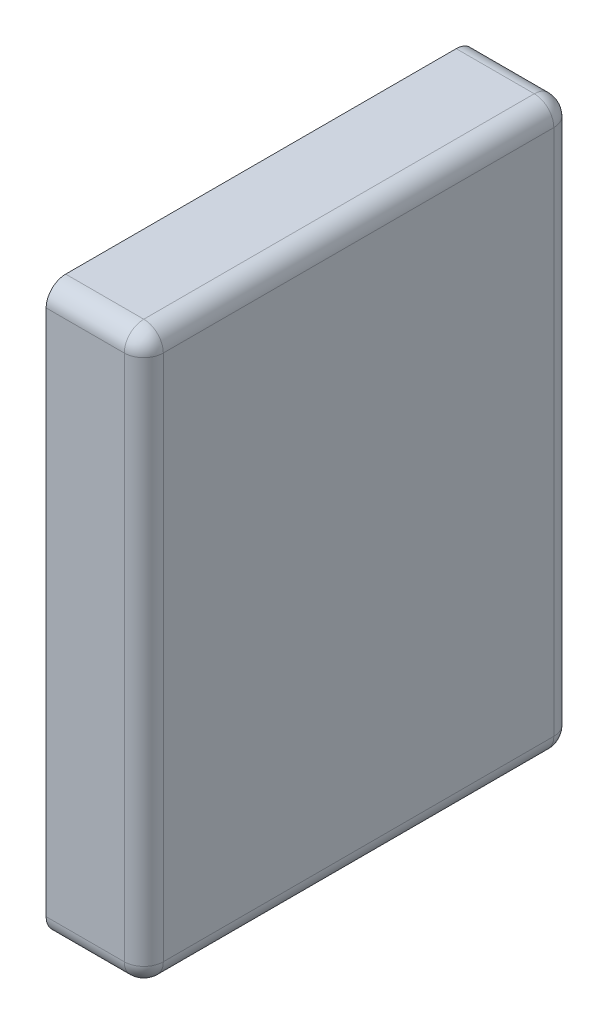
ISO-10303-21;
HEADER;
FILE_DESCRIPTION(('STEP AP214'),'2;1');
FILE_NAME('part.step','',(''),(''),'','','');
FILE_SCHEMA(('AUTOMOTIVE_DESIGN { 1 0 10303 214 1 1 1 1 }'));
ENDSEC;
DATA;
#1=APPLICATION_CONTEXT('core data for automotive mechanical design processes');
#2=APPLICATION_PROTOCOL_DEFINITION('international standard','automotive_design',2000,#1);
#3=PRODUCT_CONTEXT('',#1,'mechanical');
#4=PRODUCT('Part','Part','',(#3));
#5=PRODUCT_RELATED_PRODUCT_CATEGORY('part','',(#4));
#6=PRODUCT_DEFINITION_FORMATION('','',#4);
#7=PRODUCT_DEFINITION_CONTEXT('part definition',#1,'design');
#8=PRODUCT_DEFINITION('design','',#6,#7);
#9=PRODUCT_DEFINITION_SHAPE('','',#8);
#10=(LENGTH_UNIT() NAMED_UNIT(*) SI_UNIT(.MILLI.,.METRE.));
#11=(NAMED_UNIT(*) PLANE_ANGLE_UNIT() SI_UNIT($,.RADIAN.));
#12=(NAMED_UNIT(*) SI_UNIT($,.STERADIAN.) SOLID_ANGLE_UNIT());
#13=UNCERTAINTY_MEASURE_WITH_UNIT(LENGTH_MEASURE(1.E-05),#10,'distance_accuracy_value','');
#14=(GEOMETRIC_REPRESENTATION_CONTEXT(3) GLOBAL_UNCERTAINTY_ASSIGNED_CONTEXT((#13)) GLOBAL_UNIT_ASSIGNED_CONTEXT((#10,
#11,#12)) REPRESENTATION_CONTEXT('',''));
#15=CARTESIAN_POINT('',(0.,0.,0.));
#16=DIRECTION('',(0.,0.,1.));
#17=DIRECTION('',(1.,0.,0.));
#18=AXIS2_PLACEMENT_3D('',#15,#16,#17);
#19=CARTESIAN_POINT('',(2.2,0.,0.));
#20=DIRECTION('',(1.,0.,0.));
#21=DIRECTION('',(0.,0.,-1.));
#22=AXIS2_PLACEMENT_3D('',#19,#20,#21);
#23=PLANE('',#22);
#24=DIRECTION('',(0.,0.,1.));
#25=VECTOR('',#24,1.);
#26=CARTESIAN_POINT('',(2.2,1.4,0.));
#27=LINE('',#26,#25);
#28=CARTESIAN_POINT('',(2.2,1.4,1.05));
#29=VERTEX_POINT('',#28);
#30=CARTESIAN_POINT('',(2.2,1.4,0.05));
#31=VERTEX_POINT('',#30);
#32=EDGE_CURVE('E175',#29,#31,#27,.F.);
#33=ORIENTED_EDGE('',*,*,#32,.F.);
#34=DIRECTION('',(0.,1.,0.));
#35=VECTOR('',#34,1.);
#36=CARTESIAN_POINT('',(2.2,0.,1.05));
#37=LINE('',#36,#35);
#38=CARTESIAN_POINT('',(2.2,0.05,1.05));
#39=VERTEX_POINT('',#38);
#40=EDGE_CURVE('E165',#39,#29,#37,.T.);
#41=ORIENTED_EDGE('',*,*,#40,.F.);
#42=DIRECTION('',(0.,0.,1.));
#43=VECTOR('',#42,1.);
#44=CARTESIAN_POINT('',(2.2,0.05,0.));
#45=LINE('',#44,#43);
#46=CARTESIAN_POINT('',(2.2,0.05,0.05));
#47=VERTEX_POINT('',#46);
#48=EDGE_CURVE('E211',#47,#39,#45,.T.);
#49=ORIENTED_EDGE('',*,*,#48,.F.);
#50=DIRECTION('',(0.,1.,0.));
#51=VECTOR('',#50,1.);
#52=CARTESIAN_POINT('',(2.2,0.,0.05));
#53=LINE('',#52,#51);
#54=EDGE_CURVE('E227',#31,#47,#53,.F.);
#55=ORIENTED_EDGE('',*,*,#54,.F.);
#56=EDGE_LOOP('',(#33,#41,#49,#55));
#57=FACE_BOUND('',#56,.T.);
#58=ADVANCED_FACE('F17',(#57),#23,.T.);
#59=CARTESIAN_POINT('',(2.15,0.05,0.));
#60=DIRECTION('',(0.,0.,1.));
#61=DIRECTION('',(1.,0.,0.));
#62=AXIS2_PLACEMENT_3D('',#59,#60,#61);
#63=CYLINDRICAL_SURFACE('',#62,0.05);
#64=CARTESIAN_POINT('',(2.15,0.05,0.05));
#65=DIRECTION('',(0.,-9.5846697953635E-13,-1.));
#66=DIRECTION('',(1.,0.,0.));
#67=AXIS2_PLACEMENT_3D('',#64,#65,#66);
#68=CIRCLE('',#67,0.05);
#69=CARTESIAN_POINT('',(2.15,0.,0.050000000000012));
#70=VERTEX_POINT('',#69);
#71=EDGE_CURVE('E207',#47,#70,#68,.T.);
#72=ORIENTED_EDGE('',*,*,#71,.F.);
#73=ORIENTED_EDGE('',*,*,#48,.T.);
#74=CARTESIAN_POINT('',(2.15,0.05,1.05));
#75=DIRECTION('',(0.,0.,-1.));
#76=DIRECTION('',(1.,0.,0.));
#77=AXIS2_PLACEMENT_3D('',#74,#75,#76);
#78=CIRCLE('',#77,0.05);
#79=CARTESIAN_POINT('',(2.15,0.,1.05));
#80=VERTEX_POINT('',#79);
#81=EDGE_CURVE('E284',#80,#39,#78,.F.);
#82=ORIENTED_EDGE('',*,*,#81,.F.);
#83=DIRECTION('',(0.,0.,1.));
#84=VECTOR('',#83,1.);
#85=CARTESIAN_POINT('',(2.15,0.,0.));
#86=LINE('',#85,#84);
#87=EDGE_CURVE('E289',#80,#70,#86,.F.);
#88=ORIENTED_EDGE('',*,*,#87,.T.);
#89=EDGE_LOOP('',(#72,#73,#82,#88));
#90=FACE_BOUND('',#89,.T.);
#91=ADVANCED_FACE('F200',(#90),#63,.T.);
#92=CARTESIAN_POINT('',(2.15,0.05,0.05));
#93=DIRECTION('',(1.,0.,0.));
#94=DIRECTION('',(0.,1.,0.));
#95=AXIS2_PLACEMENT_3D('',#92,#93,#94);
#96=SPHERICAL_SURFACE('',#95,0.05);
#97=CARTESIAN_POINT('',(2.15,0.05,0.05));
#98=DIRECTION('',(1.,0.,0.));
#99=DIRECTION('',(0.,0.,-1.));
#100=AXIS2_PLACEMENT_3D('',#97,#98,#99);
#101=CIRCLE('',#100,0.05);
#102=CARTESIAN_POINT('',(2.15,0.05,0.));
#103=VERTEX_POINT('',#102);
#104=EDGE_CURVE('E124',#103,#70,#101,.F.);
#105=ORIENTED_EDGE('',*,*,#104,.F.);
#106=CARTESIAN_POINT('',(2.15,0.05,0.05));
#107=DIRECTION('',(0.,1.,0.));
#108=DIRECTION('',(0.,0.,1.));
#109=AXIS2_PLACEMENT_3D('',#106,#107,#108);
#110=CIRCLE('',#109,0.05);
#111=EDGE_CURVE('E210',#47,#103,#110,.T.);
#112=ORIENTED_EDGE('',*,*,#111,.F.);
#113=ORIENTED_EDGE('',*,*,#71,.T.);
#114=EDGE_LOOP('',(#105,#112,#113));
#115=FACE_BOUND('',#114,.T.);
#116=ADVANCED_FACE('F196',(#115),#96,.T.);
#117=CARTESIAN_POINT('',(2.15,0.,0.05));
#118=DIRECTION('',(0.,1.,0.));
#119=DIRECTION('',(0.,0.,1.));
#120=AXIS2_PLACEMENT_3D('',#117,#118,#119);
#121=CYLINDRICAL_SURFACE('',#120,0.05);
#122=CARTESIAN_POINT('',(2.15,1.4,0.0499999999999999));
#123=DIRECTION('',(0.,1.,0.));
#124=DIRECTION('',(1.,0.,0.));
#125=AXIS2_PLACEMENT_3D('',#122,#123,#124);
#126=CIRCLE('',#125,0.05);
#127=CARTESIAN_POINT('',(2.15,1.4,0.));
#128=VERTEX_POINT('',#127);
#129=EDGE_CURVE('E187',#31,#128,#126,.T.);
#130=ORIENTED_EDGE('',*,*,#129,.F.);
#131=ORIENTED_EDGE('',*,*,#54,.T.);
#132=ORIENTED_EDGE('',*,*,#111,.T.);
#133=DIRECTION('',(0.,1.,0.));
#134=VECTOR('',#133,1.);
#135=CARTESIAN_POINT('',(2.15,0.,0.));
#136=LINE('',#135,#134);
#137=EDGE_CURVE('E74',#103,#128,#136,.T.);
#138=ORIENTED_EDGE('',*,*,#137,.T.);
#139=EDGE_LOOP('',(#130,#131,#132,#138));
#140=FACE_BOUND('',#139,.T.);
#141=ADVANCED_FACE('F192',(#140),#121,.T.);
#142=CARTESIAN_POINT('',(2.15,1.4,0.05));
#143=DIRECTION('',(1.,0.,0.));
#144=DIRECTION('',(0.,1.,0.));
#145=AXIS2_PLACEMENT_3D('',#142,#143,#144);
#146=SPHERICAL_SURFACE('',#145,0.05);
#147=CARTESIAN_POINT('',(2.15,1.4,0.05));
#148=DIRECTION('',(1.,0.,0.));
#149=DIRECTION('',(0.,0.,-1.));
#150=AXIS2_PLACEMENT_3D('',#147,#148,#149);
#151=CIRCLE('',#150,0.05);
#152=CARTESIAN_POINT('',(2.15,1.45,0.05));
#153=VERTEX_POINT('',#152);
#154=EDGE_CURVE('E118',#153,#128,#151,.F.);
#155=ORIENTED_EDGE('',*,*,#154,.F.);
#156=CARTESIAN_POINT('',(2.15,1.4,0.05));
#157=DIRECTION('',(0.,0.,1.));
#158=DIRECTION('',(1.,0.,0.));
#159=AXIS2_PLACEMENT_3D('',#156,#157,#158);
#160=CIRCLE('',#159,0.05);
#161=EDGE_CURVE('E166',#31,#153,#160,.T.);
#162=ORIENTED_EDGE('',*,*,#161,.F.);
#163=ORIENTED_EDGE('',*,*,#129,.T.);
#164=EDGE_LOOP('',(#155,#162,#163));
#165=FACE_BOUND('',#164,.T.);
#166=ADVANCED_FACE('F189',(#165),#146,.T.);
#167=CARTESIAN_POINT('',(2.15,1.4,0.));
#168=DIRECTION('',(0.,0.,1.));
#169=DIRECTION('',(1.,0.,0.));
#170=AXIS2_PLACEMENT_3D('',#167,#168,#169);
#171=CYLINDRICAL_SURFACE('',#170,0.05);
#172=DIRECTION('',(0.,0.,1.));
#173=VECTOR('',#172,1.);
#174=CARTESIAN_POINT('',(2.15,1.45,0.));
#175=LINE('',#174,#173);
#176=CARTESIAN_POINT('',(2.15,1.45,1.05));
#177=VERTEX_POINT('',#176);
#178=EDGE_CURVE('E109',#177,#153,#175,.F.);
#179=ORIENTED_EDGE('',*,*,#178,.F.);
#180=CARTESIAN_POINT('',(2.15,1.4,1.05));
#181=DIRECTION('',(0.,0.,1.));
#182=DIRECTION('',(1.,0.,0.));
#183=AXIS2_PLACEMENT_3D('',#180,#181,#182);
#184=CIRCLE('',#183,0.05);
#185=EDGE_CURVE('E162',#29,#177,#184,.T.);
#186=ORIENTED_EDGE('',*,*,#185,.F.);
#187=ORIENTED_EDGE('',*,*,#32,.T.);
#188=ORIENTED_EDGE('',*,*,#161,.T.);
#189=EDGE_LOOP('',(#179,#186,#187,#188));
#190=FACE_BOUND('',#189,.T.);
#191=ADVANCED_FACE('F154',(#190),#171,.T.);
#192=CARTESIAN_POINT('',(2.15,1.4,1.05));
#193=DIRECTION('',(1.,0.,0.));
#194=DIRECTION('',(0.,0.,1.));
#195=AXIS2_PLACEMENT_3D('',#192,#193,#194);
#196=SPHERICAL_SURFACE('',#195,0.05);
#197=CARTESIAN_POINT('',(2.15,1.4,1.05));
#198=DIRECTION('',(1.,0.,0.));
#199=DIRECTION('',(0.,0.,-1.));
#200=AXIS2_PLACEMENT_3D('',#197,#198,#199);
#201=CIRCLE('',#200,0.05);
#202=CARTESIAN_POINT('',(2.15,1.4,1.1));
#203=VERTEX_POINT('',#202);
#204=EDGE_CURVE('E108',#203,#177,#201,.F.);
#205=ORIENTED_EDGE('',*,*,#204,.F.);
#206=CARTESIAN_POINT('',(2.15,1.4,1.05));
#207=DIRECTION('',(0.,1.,0.));
#208=DIRECTION('',(0.,0.,1.));
#209=AXIS2_PLACEMENT_3D('',#206,#207,#208);
#210=CIRCLE('',#209,0.05);
#211=EDGE_CURVE('E220',#29,#203,#210,.F.);
#212=ORIENTED_EDGE('',*,*,#211,.F.);
#213=ORIENTED_EDGE('',*,*,#185,.T.);
#214=EDGE_LOOP('',(#205,#212,#213));
#215=FACE_BOUND('',#214,.T.);
#216=ADVANCED_FACE('F149',(#215),#196,.T.);
#217=CARTESIAN_POINT('',(2.15,0.,1.05));
#218=DIRECTION('',(0.,1.,0.));
#219=DIRECTION('',(0.,0.,1.));
#220=AXIS2_PLACEMENT_3D('',#217,#218,#219);
#221=CYLINDRICAL_SURFACE('',#220,0.05);
#222=DIRECTION('',(0.,1.,0.));
#223=VECTOR('',#222,1.);
#224=CARTESIAN_POINT('',(2.15,0.,1.1));
#225=LINE('',#224,#223);
#226=CARTESIAN_POINT('',(2.15,0.05,1.1));
#227=VERTEX_POINT('',#226);
#228=EDGE_CURVE('E103',#227,#203,#225,.T.);
#229=ORIENTED_EDGE('',*,*,#228,.F.);
#230=CARTESIAN_POINT('',(2.15,0.0499999999999999,1.05));
#231=DIRECTION('',(0.,-1.,0.));
#232=DIRECTION('',(1.,0.,0.));
#233=AXIS2_PLACEMENT_3D('',#230,#231,#232);
#234=CIRCLE('',#233,0.05);
#235=EDGE_CURVE('E136',#39,#227,#234,.T.);
#236=ORIENTED_EDGE('',*,*,#235,.F.);
#237=ORIENTED_EDGE('',*,*,#40,.T.);
#238=ORIENTED_EDGE('',*,*,#211,.T.);
#239=EDGE_LOOP('',(#229,#236,#237,#238));
#240=FACE_BOUND('',#239,.T.);
#241=ADVANCED_FACE('F144',(#240),#221,.T.);
#242=CARTESIAN_POINT('',(2.15,0.05,1.05));
#243=DIRECTION('',(1.,0.,0.));
#244=DIRECTION('',(0.,-1.,0.));
#245=AXIS2_PLACEMENT_3D('',#242,#243,#244);
#246=SPHERICAL_SURFACE('',#245,0.05);
#247=CARTESIAN_POINT('',(2.15,0.05,1.05));
#248=DIRECTION('',(1.,0.,0.));
#249=DIRECTION('',(0.,0.,-1.));
#250=AXIS2_PLACEMENT_3D('',#247,#248,#249);
#251=CIRCLE('',#250,0.05);
#252=EDGE_CURVE('E90',#80,#227,#251,.F.);
#253=ORIENTED_EDGE('',*,*,#252,.F.);
#254=ORIENTED_EDGE('',*,*,#81,.T.);
#255=ORIENTED_EDGE('',*,*,#235,.T.);
#256=EDGE_LOOP('',(#253,#254,#255));
#257=FACE_BOUND('',#256,.T.);
#258=ADVANCED_FACE('F139',(#257),#246,.T.);
#259=CARTESIAN_POINT('',(0.,0.,0.));
#260=DIRECTION('',(0.,1.,0.));
#261=DIRECTION('',(0.,0.,1.));
#262=AXIS2_PLACEMENT_3D('',#259,#260,#261);
#263=PLANE('',#262);
#264=DIRECTION('',(1.,0.,0.));
#265=VECTOR('',#264,1.);
#266=CARTESIAN_POINT('',(0.,0.,1.05));
#267=LINE('',#266,#265);
#268=CARTESIAN_POINT('',(1.95,0.,1.05));
#269=VERTEX_POINT('',#268);
#270=EDGE_CURVE('E96',#269,#80,#267,.T.);
#271=ORIENTED_EDGE('',*,*,#270,.F.);
#272=DIRECTION('',(0.,0.,-1.));
#273=VECTOR('',#272,1.);
#274=CARTESIAN_POINT('',(1.95,0.,0.));
#275=LINE('',#274,#273);
#276=CARTESIAN_POINT('',(1.95,0.,0.05));
#277=VERTEX_POINT('',#276);
#278=EDGE_CURVE('E86',#269,#277,#275,.T.);
#279=ORIENTED_EDGE('',*,*,#278,.T.);
#280=DIRECTION('',(1.,0.,0.));
#281=VECTOR('',#280,1.);
#282=CARTESIAN_POINT('',(0.,0.,0.05));
#283=LINE('',#282,#281);
#284=EDGE_CURVE('E60',#70,#277,#283,.F.);
#285=ORIENTED_EDGE('',*,*,#284,.F.);
#286=ORIENTED_EDGE('',*,*,#87,.F.);
#287=EDGE_LOOP('',(#271,#279,#285,#286));
#288=FACE_BOUND('',#287,.T.);
#289=ADVANCED_FACE('F143',(#288),#263,.F.);
#290=CARTESIAN_POINT('',(0.,0.05,0.05));
#291=DIRECTION('',(1.,0.,0.));
#292=DIRECTION('',(0.,0.,-1.));
#293=AXIS2_PLACEMENT_3D('',#290,#291,#292);
#294=CYLINDRICAL_SURFACE('',#293,0.05);
#295=ORIENTED_EDGE('',*,*,#104,.T.);
#296=ORIENTED_EDGE('',*,*,#284,.T.);
#297=CARTESIAN_POINT('',(1.95,0.05,0.05));
#298=DIRECTION('',(1.,0.,0.));
#299=DIRECTION('',(0.,0.,-1.));
#300=AXIS2_PLACEMENT_3D('',#297,#298,#299);
#301=CIRCLE('',#300,0.05);
#302=CARTESIAN_POINT('',(1.95,0.05,0.));
#303=VERTEX_POINT('',#302);
#304=EDGE_CURVE('E20',#277,#303,#301,.T.);
#305=ORIENTED_EDGE('',*,*,#304,.T.);
#306=DIRECTION('',(1.,0.,0.));
#307=VECTOR('',#306,1.);
#308=CARTESIAN_POINT('',(0.,0.05,0.));
#309=LINE('',#308,#307);
#310=EDGE_CURVE('E67',#303,#103,#309,.T.);
#311=ORIENTED_EDGE('',*,*,#310,.T.);
#312=EDGE_LOOP('',(#295,#296,#305,#311));
#313=FACE_BOUND('',#312,.T.);
#314=ADVANCED_FACE('F85',(#313),#294,.T.);
#315=CARTESIAN_POINT('',(0.,0.,0.));
#316=DIRECTION('',(0.,0.,1.));
#317=DIRECTION('',(1.,0.,0.));
#318=AXIS2_PLACEMENT_3D('',#315,#316,#317);
#319=PLANE('',#318);
#320=ORIENTED_EDGE('',*,*,#137,.F.);
#321=ORIENTED_EDGE('',*,*,#310,.F.);
#322=DIRECTION('',(0.,1.,0.));
#323=VECTOR('',#322,1.);
#324=CARTESIAN_POINT('',(1.95,0.,0.));
#325=LINE('',#324,#323);
#326=CARTESIAN_POINT('',(1.95,1.4,0.));
#327=VERTEX_POINT('',#326);
#328=EDGE_CURVE('E71',#303,#327,#325,.T.);
#329=ORIENTED_EDGE('',*,*,#328,.T.);
#330=DIRECTION('',(1.,0.,0.));
#331=VECTOR('',#330,1.);
#332=CARTESIAN_POINT('',(0.,1.4,0.));
#333=LINE('',#332,#331);
#334=EDGE_CURVE('E114',#128,#327,#333,.F.);
#335=ORIENTED_EDGE('',*,*,#334,.F.);
#336=EDGE_LOOP('',(#320,#321,#329,#335));
#337=FACE_BOUND('',#336,.T.);
#338=ADVANCED_FACE('F69',(#337),#319,.F.);
#339=CARTESIAN_POINT('',(0.,1.4,0.05));
#340=DIRECTION('',(1.,0.,0.));
#341=DIRECTION('',(0.,0.,-1.));
#342=AXIS2_PLACEMENT_3D('',#339,#340,#341);
#343=CYLINDRICAL_SURFACE('',#342,0.05);
#344=ORIENTED_EDGE('',*,*,#334,.T.);
#345=CARTESIAN_POINT('',(1.95,1.4,0.05));
#346=DIRECTION('',(1.,0.,0.));
#347=DIRECTION('',(0.,0.,-1.));
#348=AXIS2_PLACEMENT_3D('',#345,#346,#347);
#349=CIRCLE('',#348,0.05);
#350=CARTESIAN_POINT('',(1.95,1.45,0.05));
#351=VERTEX_POINT('',#350);
#352=EDGE_CURVE('E83',#327,#351,#349,.T.);
#353=ORIENTED_EDGE('',*,*,#352,.T.);
#354=DIRECTION('',(1.,0.,0.));
#355=VECTOR('',#354,1.);
#356=CARTESIAN_POINT('',(0.,1.45,0.05));
#357=LINE('',#356,#355);
#358=EDGE_CURVE('E112',#153,#351,#357,.F.);
#359=ORIENTED_EDGE('',*,*,#358,.F.);
#360=ORIENTED_EDGE('',*,*,#154,.T.);
#361=EDGE_LOOP('',(#344,#353,#359,#360));
#362=FACE_BOUND('',#361,.T.);
#363=ADVANCED_FACE('F312',(#362),#343,.T.);
#364=CARTESIAN_POINT('',(0.,1.45,0.));
#365=DIRECTION('',(0.,1.,0.));
#366=DIRECTION('',(0.,0.,1.));
#367=AXIS2_PLACEMENT_3D('',#364,#365,#366);
#368=PLANE('',#367);
#369=DIRECTION('',(1.,0.,0.));
#370=VECTOR('',#369,1.);
#371=CARTESIAN_POINT('',(0.,1.45,1.05));
#372=LINE('',#371,#370);
#373=CARTESIAN_POINT('',(1.95,1.45,1.05));
#374=VERTEX_POINT('',#373);
#375=EDGE_CURVE('E106',#177,#374,#372,.F.);
#376=ORIENTED_EDGE('',*,*,#375,.F.);
#377=ORIENTED_EDGE('',*,*,#178,.T.);
#378=ORIENTED_EDGE('',*,*,#358,.T.);
#379=DIRECTION('',(0.,0.,-1.));
#380=VECTOR('',#379,1.);
#381=CARTESIAN_POINT('',(1.95,1.45,0.));
#382=LINE('',#381,#380);
#383=EDGE_CURVE('E234',#351,#374,#382,.F.);
#384=ORIENTED_EDGE('',*,*,#383,.T.);
#385=EDGE_LOOP('',(#376,#377,#378,#384));
#386=FACE_BOUND('',#385,.T.);
#387=ADVANCED_FACE('F252',(#386),#368,.T.);
#388=CARTESIAN_POINT('',(0.,1.4,1.05));
#389=DIRECTION('',(1.,0.,0.));
#390=DIRECTION('',(0.,0.,-1.));
#391=AXIS2_PLACEMENT_3D('',#388,#389,#390);
#392=CYLINDRICAL_SURFACE('',#391,0.05);
#393=DIRECTION('',(1.,0.,0.));
#394=VECTOR('',#393,1.);
#395=CARTESIAN_POINT('',(0.,1.4,1.1));
#396=LINE('',#395,#394);
#397=CARTESIAN_POINT('',(1.95,1.4,1.1));
#398=VERTEX_POINT('',#397);
#399=EDGE_CURVE('E99',#203,#398,#396,.F.);
#400=ORIENTED_EDGE('',*,*,#399,.F.);
#401=ORIENTED_EDGE('',*,*,#204,.T.);
#402=ORIENTED_EDGE('',*,*,#375,.T.);
#403=CARTESIAN_POINT('',(1.95,1.4,1.05));
#404=DIRECTION('',(1.,0.,0.));
#405=DIRECTION('',(0.,0.,-1.));
#406=AXIS2_PLACEMENT_3D('',#403,#404,#405);
#407=CIRCLE('',#406,0.05);
#408=EDGE_CURVE('E232',#374,#398,#407,.T.);
#409=ORIENTED_EDGE('',*,*,#408,.T.);
#410=EDGE_LOOP('',(#400,#401,#402,#409));
#411=FACE_BOUND('',#410,.T.);
#412=ADVANCED_FACE('F247',(#411),#392,.T.);
#413=CARTESIAN_POINT('',(0.,0.,1.1));
#414=DIRECTION('',(0.,0.,1.));
#415=DIRECTION('',(1.,0.,0.));
#416=AXIS2_PLACEMENT_3D('',#413,#414,#415);
#417=PLANE('',#416);
#418=ORIENTED_EDGE('',*,*,#228,.T.);
#419=ORIENTED_EDGE('',*,*,#399,.T.);
#420=DIRECTION('',(0.,1.,0.));
#421=VECTOR('',#420,1.);
#422=CARTESIAN_POINT('',(1.95,0.,1.1));
#423=LINE('',#422,#421);
#424=CARTESIAN_POINT('',(1.95,0.05,1.1));
#425=VERTEX_POINT('',#424);
#426=EDGE_CURVE('E26',#398,#425,#423,.F.);
#427=ORIENTED_EDGE('',*,*,#426,.T.);
#428=DIRECTION('',(1.,0.,0.));
#429=VECTOR('',#428,1.);
#430=CARTESIAN_POINT('',(0.,0.05,1.1));
#431=LINE('',#430,#429);
#432=EDGE_CURVE('E34',#227,#425,#431,.F.);
#433=ORIENTED_EDGE('',*,*,#432,.F.);
#434=EDGE_LOOP('',(#418,#419,#427,#433));
#435=FACE_BOUND('',#434,.T.);
#436=ADVANCED_FACE('F243',(#435),#417,.T.);
#437=CARTESIAN_POINT('',(0.,0.05,1.05));
#438=DIRECTION('',(1.,0.,0.));
#439=DIRECTION('',(0.,0.,-1.));
#440=AXIS2_PLACEMENT_3D('',#437,#438,#439);
#441=CYLINDRICAL_SURFACE('',#440,0.05);
#442=ORIENTED_EDGE('',*,*,#432,.T.);
#443=CARTESIAN_POINT('',(1.95,0.05,1.05));
#444=DIRECTION('',(1.,0.,0.));
#445=DIRECTION('',(0.,0.,-1.));
#446=AXIS2_PLACEMENT_3D('',#443,#444,#445);
#447=CIRCLE('',#446,0.05);
#448=EDGE_CURVE('E11',#425,#269,#447,.T.);
#449=ORIENTED_EDGE('',*,*,#448,.T.);
#450=ORIENTED_EDGE('',*,*,#270,.T.);
#451=ORIENTED_EDGE('',*,*,#252,.T.);
#452=EDGE_LOOP('',(#442,#449,#450,#451));
#453=FACE_BOUND('',#452,.T.);
#454=ADVANCED_FACE('F323',(#453),#441,.T.);
#455=CARTESIAN_POINT('',(1.95,0.,0.));
#456=DIRECTION('',(1.,0.,0.));
#457=DIRECTION('',(0.,0.,-1.));
#458=AXIS2_PLACEMENT_3D('',#455,#456,#457);
#459=PLANE('',#458);
#460=ORIENTED_EDGE('',*,*,#426,.F.);
#461=ORIENTED_EDGE('',*,*,#408,.F.);
#462=ORIENTED_EDGE('',*,*,#383,.F.);
#463=ORIENTED_EDGE('',*,*,#352,.F.);
#464=ORIENTED_EDGE('',*,*,#328,.F.);
#465=ORIENTED_EDGE('',*,*,#304,.F.);
#466=ORIENTED_EDGE('',*,*,#278,.F.);
#467=ORIENTED_EDGE('',*,*,#448,.F.);
#468=EDGE_LOOP('',(#460,#461,#462,#463,#464,#465,#466,#467));
#469=FACE_BOUND('',#468,.T.);
#470=ADVANCED_FACE('F79',(#469),#459,.F.);
#471=CLOSED_SHELL('',(#58,#91,#116,#141,#166,#191,#216,#241,#258,#289,#314,#338,#363,#387,#412,
#436,#454,#470));
#472=MANIFOLD_SOLID_BREP('B1',#471);
#473=ADVANCED_BREP_SHAPE_REPRESENTATION('',(#18,#472),#14);
#474=SHAPE_DEFINITION_REPRESENTATION(#9,#473);
ENDSEC;
END-ISO-10303-21;
